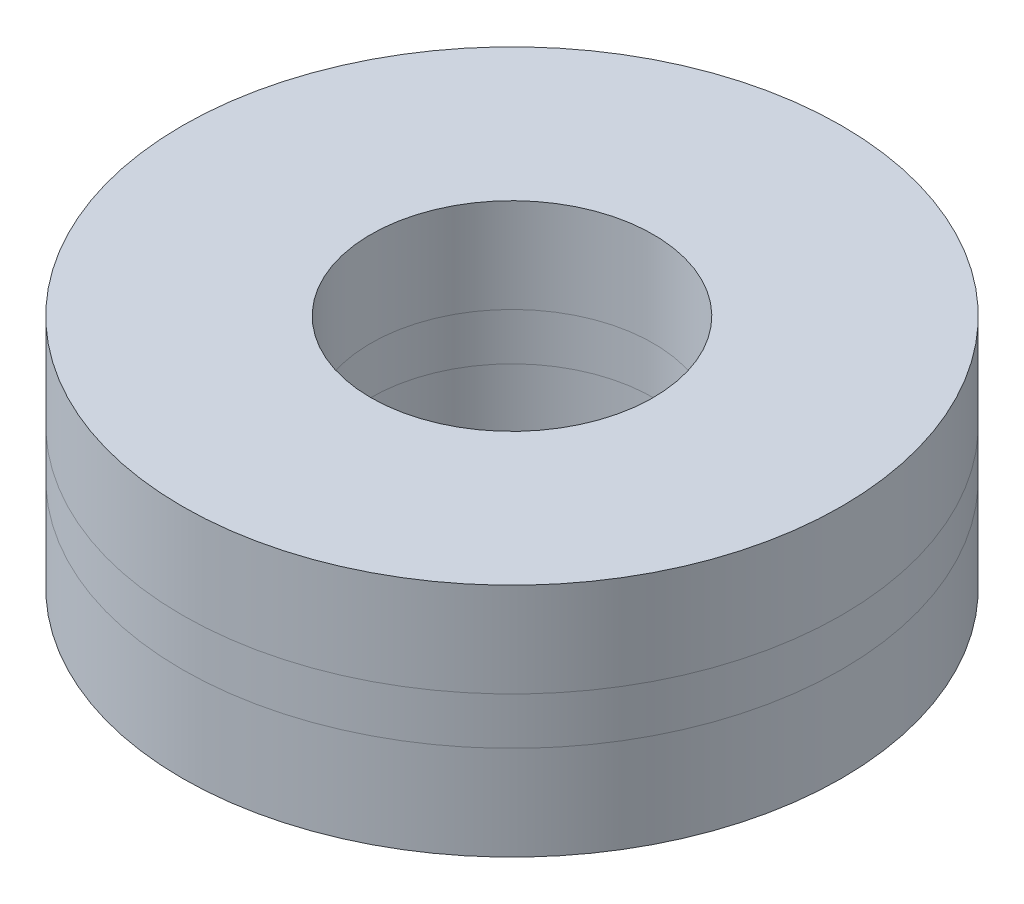
ISO-10303-21;
HEADER;
FILE_DESCRIPTION(('STEP AP214'),'2;1');
FILE_NAME('part.step','',(''),(''),'','','');
FILE_SCHEMA(('AUTOMOTIVE_DESIGN { 1 0 10303 214 1 1 1 1 }'));
ENDSEC;
DATA;
#1=APPLICATION_CONTEXT('core data for automotive mechanical design processes');
#2=APPLICATION_PROTOCOL_DEFINITION('international standard','automotive_design',2000,#1);
#3=PRODUCT_CONTEXT('',#1,'mechanical');
#4=PRODUCT('Part','Part','',(#3));
#5=PRODUCT_RELATED_PRODUCT_CATEGORY('part','',(#4));
#6=PRODUCT_DEFINITION_FORMATION('','',#4);
#7=PRODUCT_DEFINITION_CONTEXT('part definition',#1,'design');
#8=PRODUCT_DEFINITION('design','',#6,#7);
#9=PRODUCT_DEFINITION_SHAPE('','',#8);
#10=(LENGTH_UNIT() NAMED_UNIT(*) SI_UNIT(.MILLI.,.METRE.));
#11=(NAMED_UNIT(*) PLANE_ANGLE_UNIT() SI_UNIT($,.RADIAN.));
#12=(NAMED_UNIT(*) SI_UNIT($,.STERADIAN.) SOLID_ANGLE_UNIT());
#13=UNCERTAINTY_MEASURE_WITH_UNIT(LENGTH_MEASURE(1.E-05),#10,'distance_accuracy_value','');
#14=(GEOMETRIC_REPRESENTATION_CONTEXT(3) GLOBAL_UNCERTAINTY_ASSIGNED_CONTEXT((#13)) GLOBAL_UNIT_ASSIGNED_CONTEXT((#10,
#11,#12)) REPRESENTATION_CONTEXT('',''));
#15=CARTESIAN_POINT('',(0.,0.,0.));
#16=DIRECTION('',(0.,0.,1.));
#17=DIRECTION('',(1.,0.,0.));
#18=AXIS2_PLACEMENT_3D('',#15,#16,#17);
#19=CARTESIAN_POINT('',(0.,5.,0.));
#20=DIRECTION('',(0.,1.,0.));
#21=DIRECTION('',(0.,0.,1.));
#22=AXIS2_PLACEMENT_3D('',#19,#20,#21);
#23=PLANE('',#22);
#24=CARTESIAN_POINT('',(0.,5.,0.));
#25=DIRECTION('',(0.,1.,0.));
#26=DIRECTION('',(0.,0.,1.));
#27=AXIS2_PLACEMENT_3D('',#24,#25,#26);
#28=CIRCLE('',#27,7.);
#29=CARTESIAN_POINT('',(0.,5.,7.));
#30=VERTEX_POINT('',#29);
#31=EDGE_CURVE('E11',#30,#30,#28,.T.);
#32=ORIENTED_EDGE('',*,*,#31,.T.);
#33=EDGE_LOOP('',(#32));
#34=FACE_BOUND('',#33,.T.);
#35=CARTESIAN_POINT('',(0.,5.,0.));
#36=DIRECTION('',(0.,1.,0.));
#37=DIRECTION('',(0.,0.,1.));
#38=AXIS2_PLACEMENT_3D('',#35,#36,#37);
#39=CIRCLE('',#38,3.);
#40=CARTESIAN_POINT('',(0.,5.,3.));
#41=VERTEX_POINT('',#40);
#42=EDGE_CURVE('E54',#41,#41,#39,.T.);
#43=ORIENTED_EDGE('',*,*,#42,.F.);
#44=EDGE_LOOP('',(#43));
#45=FACE_BOUND('',#44,.T.);
#46=ADVANCED_FACE('F43',(#34,#45),#23,.T.);
#47=CARTESIAN_POINT('',(0.,3.,0.));
#48=DIRECTION('',(0.,1.,0.));
#49=DIRECTION('',(0.,0.,1.));
#50=AXIS2_PLACEMENT_3D('',#47,#48,#49);
#51=PLANE('',#50);
#52=CARTESIAN_POINT('',(0.,3.,0.));
#53=DIRECTION('',(0.,1.,0.));
#54=DIRECTION('',(0.,0.,1.));
#55=AXIS2_PLACEMENT_3D('',#52,#53,#54);
#56=CIRCLE('',#55,7.);
#57=CARTESIAN_POINT('',(0.,3.,7.));
#58=VERTEX_POINT('',#57);
#59=EDGE_CURVE('E47',#58,#58,#56,.T.);
#60=ORIENTED_EDGE('',*,*,#59,.F.);
#61=EDGE_LOOP('',(#60));
#62=FACE_BOUND('',#61,.T.);
#63=CARTESIAN_POINT('',(0.,3.,0.));
#64=DIRECTION('',(0.,1.,0.));
#65=DIRECTION('',(0.,0.,1.));
#66=AXIS2_PLACEMENT_3D('',#63,#64,#65);
#67=CIRCLE('',#66,3.);
#68=CARTESIAN_POINT('',(0.,3.,3.));
#69=VERTEX_POINT('',#68);
#70=EDGE_CURVE('E56',#69,#69,#67,.T.);
#71=ORIENTED_EDGE('',*,*,#70,.T.);
#72=EDGE_LOOP('',(#71));
#73=FACE_BOUND('',#72,.T.);
#74=ADVANCED_FACE('F66',(#62,#73),#51,.F.);
#75=CARTESIAN_POINT('',(0.,5.,0.));
#76=DIRECTION('',(0.,-1.,0.));
#77=DIRECTION('',(0.,0.,-1.));
#78=AXIS2_PLACEMENT_3D('',#75,#76,#77);
#79=CYLINDRICAL_SURFACE('',#78,7.);
#80=ORIENTED_EDGE('',*,*,#31,.F.);
#81=EDGE_LOOP('',(#80));
#82=FACE_BOUND('',#81,.T.);
#83=ORIENTED_EDGE('',*,*,#59,.T.);
#84=EDGE_LOOP('',(#83));
#85=FACE_BOUND('',#84,.T.);
#86=ADVANCED_FACE('F45',(#82,#85),#79,.T.);
#87=CARTESIAN_POINT('',(0.,5.,0.));
#88=DIRECTION('',(0.,-1.,0.));
#89=DIRECTION('',(0.,0.,-1.));
#90=AXIS2_PLACEMENT_3D('',#87,#88,#89);
#91=CYLINDRICAL_SURFACE('',#90,3.);
#92=ORIENTED_EDGE('',*,*,#42,.T.);
#93=EDGE_LOOP('',(#92));
#94=FACE_BOUND('',#93,.T.);
#95=ORIENTED_EDGE('',*,*,#70,.F.);
#96=EDGE_LOOP('',(#95));
#97=FACE_BOUND('',#96,.T.);
#98=ADVANCED_FACE('F62',(#94,#97),#91,.F.);
#99=CLOSED_SHELL('',(#46,#74,#86,#98));
#100=MANIFOLD_SOLID_BREP('B2',#99);
#101=CARTESIAN_POINT('',(0.,3.,0.));
#102=DIRECTION('',(0.,1.,0.));
#103=DIRECTION('',(0.,0.,1.));
#104=AXIS2_PLACEMENT_3D('',#101,#102,#103);
#105=PLANE('',#104);
#106=CARTESIAN_POINT('',(0.,3.,0.));
#107=DIRECTION('',(0.,1.,0.));
#108=DIRECTION('',(0.,0.,1.));
#109=AXIS2_PLACEMENT_3D('',#106,#107,#108);
#110=CIRCLE('',#109,7.);
#111=CARTESIAN_POINT('',(0.,3.,7.));
#112=VERTEX_POINT('',#111);
#113=EDGE_CURVE('E42',#112,#112,#110,.T.);
#114=ORIENTED_EDGE('',*,*,#113,.T.);
#115=EDGE_LOOP('',(#114));
#116=FACE_BOUND('',#115,.T.);
#117=CARTESIAN_POINT('',(0.,3.,0.));
#118=DIRECTION('',(0.,1.,0.));
#119=DIRECTION('',(0.,0.,1.));
#120=AXIS2_PLACEMENT_3D('',#117,#118,#119);
#121=CIRCLE('',#120,3.);
#122=CARTESIAN_POINT('',(0.,3.,3.));
#123=VERTEX_POINT('',#122);
#124=EDGE_CURVE('E122',#123,#123,#121,.T.);
#125=ORIENTED_EDGE('',*,*,#124,.F.);
#126=EDGE_LOOP('',(#125));
#127=FACE_BOUND('',#126,.T.);
#128=ADVANCED_FACE('F111',(#116,#127),#105,.T.);
#129=CARTESIAN_POINT('',(0.,2.,0.));
#130=DIRECTION('',(0.,1.,0.));
#131=DIRECTION('',(0.,0.,1.));
#132=AXIS2_PLACEMENT_3D('',#129,#130,#131);
#133=PLANE('',#132);
#134=CARTESIAN_POINT('',(0.,2.,0.));
#135=DIRECTION('',(0.,1.,0.));
#136=DIRECTION('',(0.,0.,1.));
#137=AXIS2_PLACEMENT_3D('',#134,#135,#136);
#138=CIRCLE('',#137,7.);
#139=CARTESIAN_POINT('',(0.,2.,7.));
#140=VERTEX_POINT('',#139);
#141=EDGE_CURVE('E115',#140,#140,#138,.T.);
#142=ORIENTED_EDGE('',*,*,#141,.F.);
#143=EDGE_LOOP('',(#142));
#144=FACE_BOUND('',#143,.T.);
#145=CARTESIAN_POINT('',(0.,2.,0.));
#146=DIRECTION('',(0.,1.,0.));
#147=DIRECTION('',(0.,0.,1.));
#148=AXIS2_PLACEMENT_3D('',#145,#146,#147);
#149=CIRCLE('',#148,3.);
#150=CARTESIAN_POINT('',(0.,2.,3.));
#151=VERTEX_POINT('',#150);
#152=EDGE_CURVE('E124',#151,#151,#149,.T.);
#153=ORIENTED_EDGE('',*,*,#152,.T.);
#154=EDGE_LOOP('',(#153));
#155=FACE_BOUND('',#154,.T.);
#156=ADVANCED_FACE('F134',(#144,#155),#133,.F.);
#157=CARTESIAN_POINT('',(0.,3.,0.));
#158=DIRECTION('',(0.,-1.,0.));
#159=DIRECTION('',(0.,0.,-1.));
#160=AXIS2_PLACEMENT_3D('',#157,#158,#159);
#161=CYLINDRICAL_SURFACE('',#160,7.);
#162=ORIENTED_EDGE('',*,*,#113,.F.);
#163=EDGE_LOOP('',(#162));
#164=FACE_BOUND('',#163,.T.);
#165=ORIENTED_EDGE('',*,*,#141,.T.);
#166=EDGE_LOOP('',(#165));
#167=FACE_BOUND('',#166,.T.);
#168=ADVANCED_FACE('F113',(#164,#167),#161,.T.);
#169=CARTESIAN_POINT('',(0.,3.,0.));
#170=DIRECTION('',(0.,-1.,0.));
#171=DIRECTION('',(0.,0.,-1.));
#172=AXIS2_PLACEMENT_3D('',#169,#170,#171);
#173=CYLINDRICAL_SURFACE('',#172,3.);
#174=ORIENTED_EDGE('',*,*,#124,.T.);
#175=EDGE_LOOP('',(#174));
#176=FACE_BOUND('',#175,.T.);
#177=ORIENTED_EDGE('',*,*,#152,.F.);
#178=EDGE_LOOP('',(#177));
#179=FACE_BOUND('',#178,.T.);
#180=ADVANCED_FACE('F130',(#176,#179),#173,.F.);
#181=CLOSED_SHELL('',(#128,#156,#168,#180));
#182=MANIFOLD_SOLID_BREP('B6',#181);
#183=CARTESIAN_POINT('',(0.,2.,0.));
#184=DIRECTION('',(0.,1.,0.));
#185=DIRECTION('',(0.,0.,1.));
#186=AXIS2_PLACEMENT_3D('',#183,#184,#185);
#187=PLANE('',#186);
#188=CARTESIAN_POINT('',(0.,2.,0.));
#189=DIRECTION('',(0.,1.,0.));
#190=DIRECTION('',(0.,0.,1.));
#191=AXIS2_PLACEMENT_3D('',#188,#189,#190);
#192=CIRCLE('',#191,7.);
#193=CARTESIAN_POINT('',(0.,2.,7.));
#194=VERTEX_POINT('',#193);
#195=EDGE_CURVE('E110',#194,#194,#192,.T.);
#196=ORIENTED_EDGE('',*,*,#195,.T.);
#197=EDGE_LOOP('',(#196));
#198=FACE_BOUND('',#197,.T.);
#199=CARTESIAN_POINT('',(0.,2.,0.));
#200=DIRECTION('',(0.,1.,0.));
#201=DIRECTION('',(0.,0.,1.));
#202=AXIS2_PLACEMENT_3D('',#199,#200,#201);
#203=CIRCLE('',#202,3.);
#204=CARTESIAN_POINT('',(0.,2.,3.));
#205=VERTEX_POINT('',#204);
#206=EDGE_CURVE('E183',#205,#205,#203,.T.);
#207=ORIENTED_EDGE('',*,*,#206,.F.);
#208=EDGE_LOOP('',(#207));
#209=FACE_BOUND('',#208,.T.);
#210=ADVANCED_FACE('F172',(#198,#209),#187,.T.);
#211=CARTESIAN_POINT('',(0.,0.,0.));
#212=DIRECTION('',(0.,1.,0.));
#213=DIRECTION('',(0.,0.,1.));
#214=AXIS2_PLACEMENT_3D('',#211,#212,#213);
#215=PLANE('',#214);
#216=CARTESIAN_POINT('',(0.,0.,0.));
#217=DIRECTION('',(0.,1.,0.));
#218=DIRECTION('',(0.,0.,1.));
#219=AXIS2_PLACEMENT_3D('',#216,#217,#218);
#220=CIRCLE('',#219,7.);
#221=CARTESIAN_POINT('',(0.,0.,7.));
#222=VERTEX_POINT('',#221);
#223=EDGE_CURVE('E176',#222,#222,#220,.T.);
#224=ORIENTED_EDGE('',*,*,#223,.F.);
#225=EDGE_LOOP('',(#224));
#226=FACE_BOUND('',#225,.T.);
#227=CARTESIAN_POINT('',(0.,0.,0.));
#228=DIRECTION('',(0.,1.,0.));
#229=DIRECTION('',(0.,0.,1.));
#230=AXIS2_PLACEMENT_3D('',#227,#228,#229);
#231=CIRCLE('',#230,3.);
#232=CARTESIAN_POINT('',(0.,0.,3.));
#233=VERTEX_POINT('',#232);
#234=EDGE_CURVE('E185',#233,#233,#231,.T.);
#235=ORIENTED_EDGE('',*,*,#234,.T.);
#236=EDGE_LOOP('',(#235));
#237=FACE_BOUND('',#236,.T.);
#238=ADVANCED_FACE('F195',(#226,#237),#215,.F.);
#239=CARTESIAN_POINT('',(0.,2.,0.));
#240=DIRECTION('',(0.,-1.,0.));
#241=DIRECTION('',(0.,0.,-1.));
#242=AXIS2_PLACEMENT_3D('',#239,#240,#241);
#243=CYLINDRICAL_SURFACE('',#242,7.);
#244=ORIENTED_EDGE('',*,*,#195,.F.);
#245=EDGE_LOOP('',(#244));
#246=FACE_BOUND('',#245,.T.);
#247=ORIENTED_EDGE('',*,*,#223,.T.);
#248=EDGE_LOOP('',(#247));
#249=FACE_BOUND('',#248,.T.);
#250=ADVANCED_FACE('F174',(#246,#249),#243,.T.);
#251=CARTESIAN_POINT('',(0.,2.,0.));
#252=DIRECTION('',(0.,-1.,0.));
#253=DIRECTION('',(0.,0.,-1.));
#254=AXIS2_PLACEMENT_3D('',#251,#252,#253);
#255=CYLINDRICAL_SURFACE('',#254,3.);
#256=ORIENTED_EDGE('',*,*,#206,.T.);
#257=EDGE_LOOP('',(#256));
#258=FACE_BOUND('',#257,.T.);
#259=ORIENTED_EDGE('',*,*,#234,.F.);
#260=EDGE_LOOP('',(#259));
#261=FACE_BOUND('',#260,.T.);
#262=ADVANCED_FACE('F191',(#258,#261),#255,.F.);
#263=CLOSED_SHELL('',(#210,#238,#250,#262));
#264=MANIFOLD_SOLID_BREP('B37',#263);
#265=ADVANCED_BREP_SHAPE_REPRESENTATION('',(#18,#100,#182,#264),#14);
#266=SHAPE_DEFINITION_REPRESENTATION(#9,#265);
ENDSEC;
END-ISO-10303-21;
